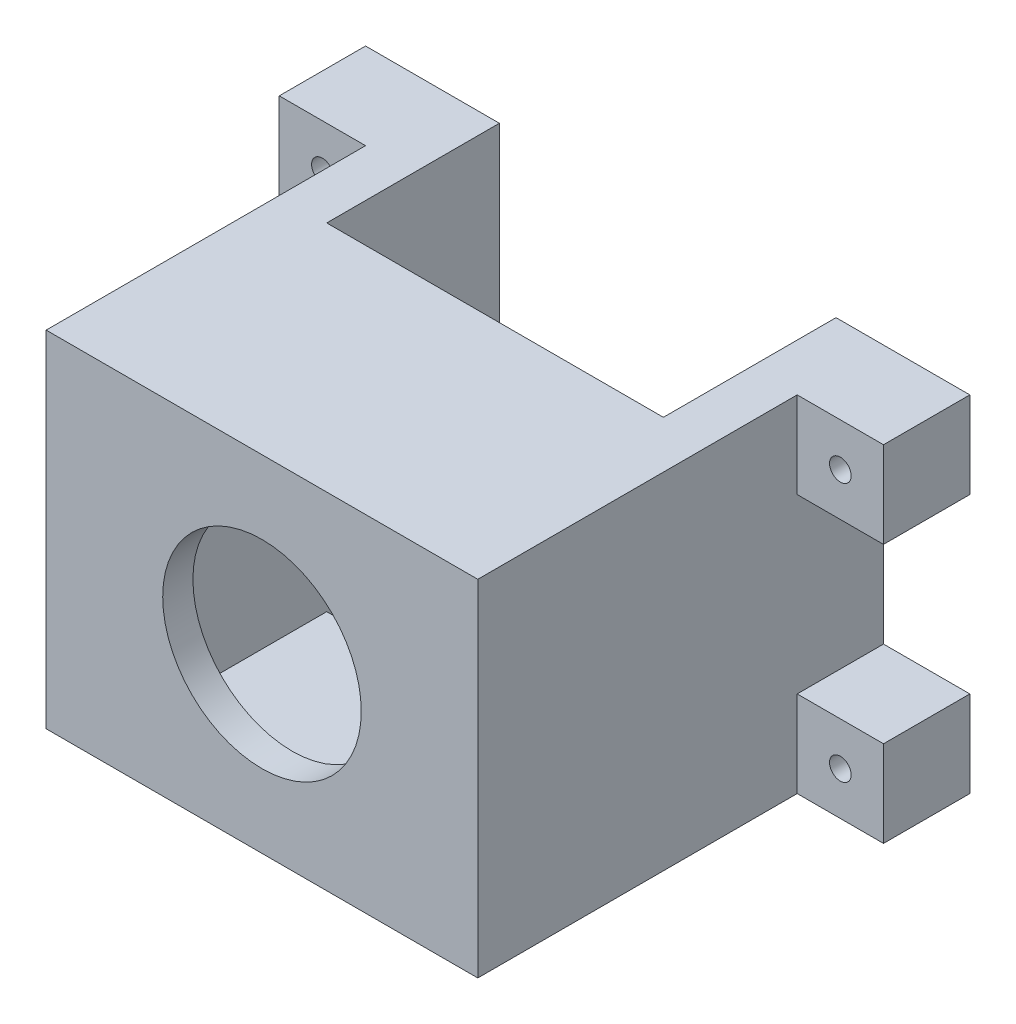
ISO-10303-21;
HEADER;
FILE_DESCRIPTION(('STEP AP214'),'2;1');
FILE_NAME('part.step','',(''),(''),'','','');
FILE_SCHEMA(('AUTOMOTIVE_DESIGN { 1 0 10303 214 1 1 1 1 }'));
ENDSEC;
DATA;
#1=APPLICATION_CONTEXT('core data for automotive mechanical design processes');
#2=APPLICATION_PROTOCOL_DEFINITION('international standard','automotive_design',2000,#1);
#3=PRODUCT_CONTEXT('',#1,'mechanical');
#4=PRODUCT('Part','Part','',(#3));
#5=PRODUCT_RELATED_PRODUCT_CATEGORY('part','',(#4));
#6=PRODUCT_DEFINITION_FORMATION('','',#4);
#7=PRODUCT_DEFINITION_CONTEXT('part definition',#1,'design');
#8=PRODUCT_DEFINITION('design','',#6,#7);
#9=PRODUCT_DEFINITION_SHAPE('','',#8);
#10=(LENGTH_UNIT() NAMED_UNIT(*) SI_UNIT(.MILLI.,.METRE.));
#11=(NAMED_UNIT(*) PLANE_ANGLE_UNIT() SI_UNIT($,.RADIAN.));
#12=(NAMED_UNIT(*) SI_UNIT($,.STERADIAN.) SOLID_ANGLE_UNIT());
#13=UNCERTAINTY_MEASURE_WITH_UNIT(LENGTH_MEASURE(1.E-05),#10,'distance_accuracy_value','');
#14=(GEOMETRIC_REPRESENTATION_CONTEXT(3) GLOBAL_UNCERTAINTY_ASSIGNED_CONTEXT((#13)) GLOBAL_UNIT_ASSIGNED_CONTEXT((#10,
#11,#12)) REPRESENTATION_CONTEXT('',''));
#15=CARTESIAN_POINT('',(0.,0.,0.));
#16=DIRECTION('',(0.,0.,1.));
#17=DIRECTION('',(1.,0.,0.));
#18=AXIS2_PLACEMENT_3D('',#15,#16,#17);
#19=CARTESIAN_POINT('',(0.,0.,0.));
#20=DIRECTION('',(0.,0.,1.));
#21=DIRECTION('',(1.,0.,0.));
#22=AXIS2_PLACEMENT_3D('',#19,#20,#21);
#23=PLANE('',#22);
#24=CARTESIAN_POINT('',(-30.,-15.,0.));
#25=DIRECTION('',(0.,0.,1.));
#26=DIRECTION('',(1.,0.,0.));
#27=AXIS2_PLACEMENT_3D('',#24,#25,#26);
#28=CIRCLE('',#27,1.25);
#29=CARTESIAN_POINT('',(-28.75,-15.,0.));
#30=VERTEX_POINT('',#29);
#31=EDGE_CURVE('E407',#30,#30,#28,.T.);
#32=ORIENTED_EDGE('',*,*,#31,.T.);
#33=EDGE_LOOP('',(#32));
#34=FACE_BOUND('',#33,.T.);
#35=CARTESIAN_POINT('',(-30.,15.,0.));
#36=DIRECTION('',(0.,0.,1.));
#37=DIRECTION('',(1.,0.,0.));
#38=AXIS2_PLACEMENT_3D('',#35,#36,#37);
#39=CIRCLE('',#38,1.25);
#40=CARTESIAN_POINT('',(-28.75,15.,0.));
#41=VERTEX_POINT('',#40);
#42=EDGE_CURVE('E360',#41,#41,#39,.T.);
#43=ORIENTED_EDGE('',*,*,#42,.T.);
#44=EDGE_LOOP('',(#43));
#45=FACE_BOUND('',#44,.T.);
#46=DIRECTION('',(-1.,0.,0.));
#47=VECTOR('',#46,1.);
#48=CARTESIAN_POINT('',(-25.,20.,0.));
#49=LINE('',#48,#47);
#50=CARTESIAN_POINT('',(-19.5,20.,0.));
#51=VERTEX_POINT('',#50);
#52=CARTESIAN_POINT('',(-35.,20.,0.));
#53=VERTEX_POINT('',#52);
#54=EDGE_CURVE('E203',#51,#53,#49,.T.);
#55=ORIENTED_EDGE('',*,*,#54,.F.);
#56=DIRECTION('',(0.,-1.,0.));
#57=VECTOR('',#56,1.);
#58=CARTESIAN_POINT('',(-19.5,19.,0.));
#59=LINE('',#58,#57);
#60=CARTESIAN_POINT('',(-19.5,-20.,0.));
#61=VERTEX_POINT('',#60);
#62=EDGE_CURVE('E214',#51,#61,#59,.T.);
#63=ORIENTED_EDGE('',*,*,#62,.T.);
#64=DIRECTION('',(1.,0.,0.));
#65=VECTOR('',#64,1.);
#66=CARTESIAN_POINT('',(-25.,-20.,0.));
#67=LINE('',#66,#65);
#68=CARTESIAN_POINT('',(-35.,-20.,0.));
#69=VERTEX_POINT('',#68);
#70=EDGE_CURVE('E236',#69,#61,#67,.T.);
#71=ORIENTED_EDGE('',*,*,#70,.F.);
#72=DIRECTION('',(0.,-1.,0.));
#73=VECTOR('',#72,1.);
#74=CARTESIAN_POINT('',(-35.,-10.,0.));
#75=LINE('',#74,#73);
#76=CARTESIAN_POINT('',(-35.,-10.,0.));
#77=VERTEX_POINT('',#76);
#78=EDGE_CURVE('E273',#77,#69,#75,.T.);
#79=ORIENTED_EDGE('',*,*,#78,.F.);
#80=DIRECTION('',(-1.,0.,0.));
#81=VECTOR('',#80,1.);
#82=CARTESIAN_POINT('',(-35.,-10.,0.));
#83=LINE('',#82,#81);
#84=CARTESIAN_POINT('',(-25.,-10.,0.));
#85=VERTEX_POINT('',#84);
#86=EDGE_CURVE('E286',#85,#77,#83,.T.);
#87=ORIENTED_EDGE('',*,*,#86,.F.);
#88=DIRECTION('',(0.,-1.,0.));
#89=VECTOR('',#88,1.);
#90=CARTESIAN_POINT('',(-25.,20.,0.));
#91=LINE('',#90,#89);
#92=CARTESIAN_POINT('',(-25.,10.,0.));
#93=VERTEX_POINT('',#92);
#94=EDGE_CURVE('E229',#93,#85,#91,.T.);
#95=ORIENTED_EDGE('',*,*,#94,.F.);
#96=DIRECTION('',(-1.,0.,0.));
#97=VECTOR('',#96,1.);
#98=CARTESIAN_POINT('',(-35.,10.,0.));
#99=LINE('',#98,#97);
#100=CARTESIAN_POINT('',(-35.,10.,0.));
#101=VERTEX_POINT('',#100);
#102=EDGE_CURVE('E362',#93,#101,#99,.T.);
#103=ORIENTED_EDGE('',*,*,#102,.T.);
#104=DIRECTION('',(0.,1.,0.));
#105=VECTOR('',#104,1.);
#106=CARTESIAN_POINT('',(-35.,10.,0.));
#107=LINE('',#106,#105);
#108=EDGE_CURVE('E225',#101,#53,#107,.T.);
#109=ORIENTED_EDGE('',*,*,#108,.T.);
#110=EDGE_LOOP('',(#55,#63,#71,#79,#87,#95,#103,#109));
#111=FACE_BOUND('',#110,.T.);
#112=ADVANCED_FACE('F41',(#34,#45,#111),#23,.F.);
#113=CARTESIAN_POINT('',(30.,-15.,0.));
#114=DIRECTION('',(0.,0.,1.));
#115=DIRECTION('',(1.,0.,0.));
#116=AXIS2_PLACEMENT_3D('',#113,#114,#115);
#117=CIRCLE('',#116,1.25);
#118=CARTESIAN_POINT('',(31.25,-15.,0.));
#119=VERTEX_POINT('',#118);
#120=EDGE_CURVE('E401',#119,#119,#117,.T.);
#121=ORIENTED_EDGE('',*,*,#120,.T.);
#122=EDGE_LOOP('',(#121));
#123=FACE_BOUND('',#122,.T.);
#124=CARTESIAN_POINT('',(30.,15.,0.));
#125=DIRECTION('',(0.,0.,1.));
#126=DIRECTION('',(1.,0.,0.));
#127=AXIS2_PLACEMENT_3D('',#124,#125,#126);
#128=CIRCLE('',#127,1.25);
#129=CARTESIAN_POINT('',(31.25,15.,0.));
#130=VERTEX_POINT('',#129);
#131=EDGE_CURVE('E806',#130,#130,#128,.T.);
#132=ORIENTED_EDGE('',*,*,#131,.T.);
#133=EDGE_LOOP('',(#132));
#134=FACE_BOUND('',#133,.T.);
#135=DIRECTION('',(0.,1.,0.));
#136=VECTOR('',#135,1.);
#137=CARTESIAN_POINT('',(19.5,19.,0.));
#138=LINE('',#137,#136);
#139=CARTESIAN_POINT('',(19.5,-20.,0.));
#140=VERTEX_POINT('',#139);
#141=CARTESIAN_POINT('',(19.5,20.,0.));
#142=VERTEX_POINT('',#141);
#143=EDGE_CURVE('E221',#140,#142,#138,.T.);
#144=ORIENTED_EDGE('',*,*,#143,.T.);
#145=CARTESIAN_POINT('',(35.,20.,0.));
#146=VERTEX_POINT('',#145);
#147=EDGE_CURVE('E226',#146,#142,#49,.T.);
#148=ORIENTED_EDGE('',*,*,#147,.F.);
#149=DIRECTION('',(0.,-1.,0.));
#150=VECTOR('',#149,1.);
#151=CARTESIAN_POINT('',(35.,10.,0.));
#152=LINE('',#151,#150);
#153=CARTESIAN_POINT('',(35.,10.,0.));
#154=VERTEX_POINT('',#153);
#155=EDGE_CURVE('E357',#146,#154,#152,.T.);
#156=ORIENTED_EDGE('',*,*,#155,.T.);
#157=CARTESIAN_POINT('',(25.,10.,0.));
#158=VERTEX_POINT('',#157);
#159=EDGE_CURVE('E347',#154,#158,#99,.T.);
#160=ORIENTED_EDGE('',*,*,#159,.T.);
#161=DIRECTION('',(0.,1.,0.));
#162=VECTOR('',#161,1.);
#163=CARTESIAN_POINT('',(25.,20.,0.));
#164=LINE('',#163,#162);
#165=CARTESIAN_POINT('',(25.,-10.,0.));
#166=VERTEX_POINT('',#165);
#167=EDGE_CURVE('E61',#166,#158,#164,.T.);
#168=ORIENTED_EDGE('',*,*,#167,.F.);
#169=CARTESIAN_POINT('',(35.,-10.,0.));
#170=VERTEX_POINT('',#169);
#171=EDGE_CURVE('E287',#170,#166,#83,.T.);
#172=ORIENTED_EDGE('',*,*,#171,.F.);
#173=DIRECTION('',(0.,1.,0.));
#174=VECTOR('',#173,1.);
#175=CARTESIAN_POINT('',(35.,-10.,0.));
#176=LINE('',#175,#174);
#177=CARTESIAN_POINT('',(35.,-20.,0.));
#178=VERTEX_POINT('',#177);
#179=EDGE_CURVE('E255',#178,#170,#176,.T.);
#180=ORIENTED_EDGE('',*,*,#179,.F.);
#181=EDGE_CURVE('E235',#140,#178,#67,.T.);
#182=ORIENTED_EDGE('',*,*,#181,.F.);
#183=EDGE_LOOP('',(#144,#148,#156,#160,#168,#172,#180,#182));
#184=FACE_BOUND('',#183,.T.);
#185=ADVANCED_FACE('F440',(#123,#134,#184),#23,.F.);
#186=CARTESIAN_POINT('',(-25.,20.,47.));
#187=DIRECTION('',(0.,-1.,0.));
#188=DIRECTION('',(0.,0.,-1.));
#189=AXIS2_PLACEMENT_3D('',#186,#187,#188);
#190=PLANE('',#189);
#191=DIRECTION('',(0.,0.,-1.));
#192=VECTOR('',#191,1.);
#193=CARTESIAN_POINT('',(-19.5,20.,47.));
#194=LINE('',#193,#192);
#195=CARTESIAN_POINT('',(-19.5,20.,20.));
#196=VERTEX_POINT('',#195);
#197=EDGE_CURVE('E199',#196,#51,#194,.T.);
#198=ORIENTED_EDGE('',*,*,#197,.T.);
#199=ORIENTED_EDGE('',*,*,#54,.T.);
#200=DIRECTION('',(0.,0.,-1.));
#201=VECTOR('',#200,1.);
#202=CARTESIAN_POINT('',(-35.,20.,10.));
#203=LINE('',#202,#201);
#204=CARTESIAN_POINT('',(-35.,20.,10.));
#205=VERTEX_POINT('',#204);
#206=EDGE_CURVE('E369',#205,#53,#203,.T.);
#207=ORIENTED_EDGE('',*,*,#206,.F.);
#208=DIRECTION('',(1.,0.,0.));
#209=VECTOR('',#208,1.);
#210=CARTESIAN_POINT('',(-35.,20.,10.));
#211=LINE('',#210,#209);
#212=CARTESIAN_POINT('',(-25.,20.,9.99999999999999));
#213=VERTEX_POINT('',#212);
#214=EDGE_CURVE('E343',#205,#213,#211,.T.);
#215=ORIENTED_EDGE('',*,*,#214,.T.);
#216=DIRECTION('',(0.,0.,-1.));
#217=VECTOR('',#216,1.);
#218=CARTESIAN_POINT('',(-25.,20.,47.));
#219=LINE('',#218,#217);
#220=CARTESIAN_POINT('',(-25.,20.,47.));
#221=VERTEX_POINT('',#220);
#222=EDGE_CURVE('E245',#221,#213,#219,.T.);
#223=ORIENTED_EDGE('',*,*,#222,.F.);
#224=DIRECTION('',(-1.,0.,0.));
#225=VECTOR('',#224,1.);
#226=CARTESIAN_POINT('',(-25.,20.,47.));
#227=LINE('',#226,#225);
#228=CARTESIAN_POINT('',(25.,20.,47.));
#229=VERTEX_POINT('',#228);
#230=EDGE_CURVE('E314',#229,#221,#227,.T.);
#231=ORIENTED_EDGE('',*,*,#230,.F.);
#232=DIRECTION('',(0.,0.,-1.));
#233=VECTOR('',#232,1.);
#234=CARTESIAN_POINT('',(25.,20.,47.));
#235=LINE('',#234,#233);
#236=CARTESIAN_POINT('',(25.,20.,9.99999999999999));
#237=VERTEX_POINT('',#236);
#238=EDGE_CURVE('E49',#229,#237,#235,.T.);
#239=ORIENTED_EDGE('',*,*,#238,.T.);
#240=CARTESIAN_POINT('',(35.,20.,10.));
#241=VERTEX_POINT('',#240);
#242=EDGE_CURVE('E333',#237,#241,#211,.T.);
#243=ORIENTED_EDGE('',*,*,#242,.T.);
#244=DIRECTION('',(0.,0.,-1.));
#245=VECTOR('',#244,1.);
#246=CARTESIAN_POINT('',(35.,20.,10.));
#247=LINE('',#246,#245);
#248=EDGE_CURVE('E371',#241,#146,#247,.T.);
#249=ORIENTED_EDGE('',*,*,#248,.T.);
#250=ORIENTED_EDGE('',*,*,#147,.T.);
#251=DIRECTION('',(0.,0.,1.));
#252=VECTOR('',#251,1.);
#253=CARTESIAN_POINT('',(19.5,20.,47.));
#254=LINE('',#253,#252);
#255=CARTESIAN_POINT('',(19.5,20.,20.));
#256=VERTEX_POINT('',#255);
#257=EDGE_CURVE('E396',#142,#256,#254,.T.);
#258=ORIENTED_EDGE('',*,*,#257,.T.);
#259=DIRECTION('',(1.,0.,0.));
#260=VECTOR('',#259,1.);
#261=CARTESIAN_POINT('',(-25.,20.,20.));
#262=LINE('',#261,#260);
#263=EDGE_CURVE('E206',#196,#256,#262,.T.);
#264=ORIENTED_EDGE('',*,*,#263,.F.);
#265=EDGE_LOOP('',(#198,#199,#207,#215,#223,#231,#239,#243,#249,#250,#258,#264));
#266=FACE_BOUND('',#265,.T.);
#267=ADVANCED_FACE('F201',(#266),#190,.F.);
#268=CARTESIAN_POINT('',(-19.5,19.,43.5));
#269=DIRECTION('',(0.,-1.,0.));
#270=DIRECTION('',(0.,0.,-1.));
#271=AXIS2_PLACEMENT_3D('',#268,#269,#270);
#272=PLANE('',#271);
#273=DIRECTION('',(0.,0.,-1.));
#274=VECTOR('',#273,1.);
#275=CARTESIAN_POINT('',(-19.5,19.,43.5));
#276=LINE('',#275,#274);
#277=CARTESIAN_POINT('',(-19.5,19.,43.5));
#278=VERTEX_POINT('',#277);
#279=CARTESIAN_POINT('',(-19.5,19.,20.));
#280=VERTEX_POINT('',#279);
#281=EDGE_CURVE('E258',#278,#280,#276,.T.);
#282=ORIENTED_EDGE('',*,*,#281,.T.);
#283=DIRECTION('',(1.,0.,0.));
#284=VECTOR('',#283,1.);
#285=CARTESIAN_POINT('',(-19.5,19.,20.));
#286=LINE('',#285,#284);
#287=CARTESIAN_POINT('',(19.5,19.,20.));
#288=VERTEX_POINT('',#287);
#289=EDGE_CURVE('E387',#280,#288,#286,.T.);
#290=ORIENTED_EDGE('',*,*,#289,.T.);
#291=DIRECTION('',(0.,0.,-1.));
#292=VECTOR('',#291,1.);
#293=CARTESIAN_POINT('',(19.5,19.,43.5));
#294=LINE('',#293,#292);
#295=CARTESIAN_POINT('',(19.5,19.,43.5));
#296=VERTEX_POINT('',#295);
#297=EDGE_CURVE('E251',#296,#288,#294,.T.);
#298=ORIENTED_EDGE('',*,*,#297,.F.);
#299=DIRECTION('',(-1.,0.,0.));
#300=VECTOR('',#299,1.);
#301=CARTESIAN_POINT('',(-19.5,19.,43.5));
#302=LINE('',#301,#300);
#303=EDGE_CURVE('E411',#296,#278,#302,.T.);
#304=ORIENTED_EDGE('',*,*,#303,.T.);
#305=EDGE_LOOP('',(#282,#290,#298,#304));
#306=FACE_BOUND('',#305,.T.);
#307=ADVANCED_FACE('F435',(#306),#272,.T.);
#308=CARTESIAN_POINT('',(-19.5,-19.,43.5));
#309=DIRECTION('',(0.,1.,0.));
#310=DIRECTION('',(0.,0.,1.));
#311=AXIS2_PLACEMENT_3D('',#308,#309,#310);
#312=PLANE('',#311);
#313=DIRECTION('',(0.,0.,-1.));
#314=VECTOR('',#313,1.);
#315=CARTESIAN_POINT('',(19.5,-19.,43.5));
#316=LINE('',#315,#314);
#317=CARTESIAN_POINT('',(19.5,-19.,43.5));
#318=VERTEX_POINT('',#317);
#319=CARTESIAN_POINT('',(19.5,-19.,20.));
#320=VERTEX_POINT('',#319);
#321=EDGE_CURVE('E417',#318,#320,#316,.T.);
#322=ORIENTED_EDGE('',*,*,#321,.T.);
#323=DIRECTION('',(-1.,0.,0.));
#324=VECTOR('',#323,1.);
#325=CARTESIAN_POINT('',(-19.5,-19.,20.));
#326=LINE('',#325,#324);
#327=CARTESIAN_POINT('',(-19.5,-19.,20.));
#328=VERTEX_POINT('',#327);
#329=EDGE_CURVE('E11',#320,#328,#326,.T.);
#330=ORIENTED_EDGE('',*,*,#329,.T.);
#331=DIRECTION('',(0.,0.,-1.));
#332=VECTOR('',#331,1.);
#333=CARTESIAN_POINT('',(-19.5,-19.,43.5));
#334=LINE('',#333,#332);
#335=CARTESIAN_POINT('',(-19.5,-19.,43.5));
#336=VERTEX_POINT('',#335);
#337=EDGE_CURVE('E265',#336,#328,#334,.T.);
#338=ORIENTED_EDGE('',*,*,#337,.F.);
#339=DIRECTION('',(1.,0.,0.));
#340=VECTOR('',#339,1.);
#341=CARTESIAN_POINT('',(-19.5,-19.,43.5));
#342=LINE('',#341,#340);
#343=EDGE_CURVE('E415',#336,#318,#342,.T.);
#344=ORIENTED_EDGE('',*,*,#343,.T.);
#345=EDGE_LOOP('',(#322,#330,#338,#344));
#346=FACE_BOUND('',#345,.T.);
#347=ADVANCED_FACE('F427',(#346),#312,.T.);
#348=CARTESIAN_POINT('',(25.,20.,47.));
#349=DIRECTION('',(-1.,0.,0.));
#350=DIRECTION('',(0.,0.,1.));
#351=AXIS2_PLACEMENT_3D('',#348,#349,#350);
#352=PLANE('',#351);
#353=ORIENTED_EDGE('',*,*,#167,.T.);
#354=DIRECTION('',(0.,0.,1.));
#355=VECTOR('',#354,1.);
#356=CARTESIAN_POINT('',(25.,10.,47.));
#357=LINE('',#356,#355);
#358=CARTESIAN_POINT('',(25.,10.,9.99999999999999));
#359=VERTEX_POINT('',#358);
#360=EDGE_CURVE('E56',#158,#359,#357,.T.);
#361=ORIENTED_EDGE('',*,*,#360,.T.);
#362=DIRECTION('',(0.,1.,0.));
#363=VECTOR('',#362,1.);
#364=CARTESIAN_POINT('',(25.,20.,9.99999999999999));
#365=LINE('',#364,#363);
#366=EDGE_CURVE('E330',#359,#237,#365,.T.);
#367=ORIENTED_EDGE('',*,*,#366,.T.);
#368=ORIENTED_EDGE('',*,*,#238,.F.);
#369=DIRECTION('',(0.,1.,0.));
#370=VECTOR('',#369,1.);
#371=CARTESIAN_POINT('',(25.,20.,47.));
#372=LINE('',#371,#370);
#373=CARTESIAN_POINT('',(25.,-20.,47.));
#374=VERTEX_POINT('',#373);
#375=EDGE_CURVE('E238',#374,#229,#372,.T.);
#376=ORIENTED_EDGE('',*,*,#375,.F.);
#377=DIRECTION('',(0.,0.,-1.));
#378=VECTOR('',#377,1.);
#379=CARTESIAN_POINT('',(25.,-20.,47.));
#380=LINE('',#379,#378);
#381=CARTESIAN_POINT('',(25.,-20.,9.99999999999999));
#382=VERTEX_POINT('',#381);
#383=EDGE_CURVE('E239',#374,#382,#380,.T.);
#384=ORIENTED_EDGE('',*,*,#383,.T.);
#385=DIRECTION('',(0.,1.,0.));
#386=VECTOR('',#385,1.);
#387=CARTESIAN_POINT('',(25.,20.,9.99999999999999));
#388=LINE('',#387,#386);
#389=CARTESIAN_POINT('',(25.,-10.,9.99999999999999));
#390=VERTEX_POINT('',#389);
#391=EDGE_CURVE('E230',#382,#390,#388,.T.);
#392=ORIENTED_EDGE('',*,*,#391,.T.);
#393=DIRECTION('',(0.,0.,1.));
#394=VECTOR('',#393,1.);
#395=CARTESIAN_POINT('',(25.,-10.,47.));
#396=LINE('',#395,#394);
#397=EDGE_CURVE('E306',#166,#390,#396,.T.);
#398=ORIENTED_EDGE('',*,*,#397,.F.);
#399=EDGE_LOOP('',(#353,#361,#367,#368,#376,#384,#392,#398));
#400=FACE_BOUND('',#399,.T.);
#401=ADVANCED_FACE('F43',(#400),#352,.F.);
#402=CARTESIAN_POINT('',(-25.,20.,47.));
#403=DIRECTION('',(1.,0.,0.));
#404=DIRECTION('',(0.,1.,0.));
#405=AXIS2_PLACEMENT_3D('',#402,#403,#404);
#406=PLANE('',#405);
#407=DIRECTION('',(0.,-1.,0.));
#408=VECTOR('',#407,1.);
#409=CARTESIAN_POINT('',(-25.,20.,9.99999999999999));
#410=LINE('',#409,#408);
#411=CARTESIAN_POINT('',(-25.,10.,9.99999999999999));
#412=VERTEX_POINT('',#411);
#413=EDGE_CURVE('E373',#213,#412,#410,.T.);
#414=ORIENTED_EDGE('',*,*,#413,.T.);
#415=DIRECTION('',(0.,0.,-1.));
#416=VECTOR('',#415,1.);
#417=CARTESIAN_POINT('',(-25.,10.,47.));
#418=LINE('',#417,#416);
#419=EDGE_CURVE('E376',#412,#93,#418,.T.);
#420=ORIENTED_EDGE('',*,*,#419,.T.);
#421=ORIENTED_EDGE('',*,*,#94,.T.);
#422=DIRECTION('',(0.,0.,-1.));
#423=VECTOR('',#422,1.);
#424=CARTESIAN_POINT('',(-25.,-10.,47.));
#425=LINE('',#424,#423);
#426=CARTESIAN_POINT('',(-25.,-10.,9.99999999999999));
#427=VERTEX_POINT('',#426);
#428=EDGE_CURVE('E303',#427,#85,#425,.T.);
#429=ORIENTED_EDGE('',*,*,#428,.F.);
#430=DIRECTION('',(0.,-1.,0.));
#431=VECTOR('',#430,1.);
#432=CARTESIAN_POINT('',(-25.,20.,9.99999999999999));
#433=LINE('',#432,#431);
#434=CARTESIAN_POINT('',(-25.,-20.,9.99999999999999));
#435=VERTEX_POINT('',#434);
#436=EDGE_CURVE('E309',#427,#435,#433,.T.);
#437=ORIENTED_EDGE('',*,*,#436,.T.);
#438=DIRECTION('',(0.,0.,-1.));
#439=VECTOR('',#438,1.);
#440=CARTESIAN_POINT('',(-25.,-20.,47.));
#441=LINE('',#440,#439);
#442=CARTESIAN_POINT('',(-25.,-20.,47.));
#443=VERTEX_POINT('',#442);
#444=EDGE_CURVE('E241',#443,#435,#441,.T.);
#445=ORIENTED_EDGE('',*,*,#444,.F.);
#446=DIRECTION('',(0.,-1.,0.));
#447=VECTOR('',#446,1.);
#448=CARTESIAN_POINT('',(-25.,20.,47.));
#449=LINE('',#448,#447);
#450=EDGE_CURVE('E316',#221,#443,#449,.T.);
#451=ORIENTED_EDGE('',*,*,#450,.F.);
#452=ORIENTED_EDGE('',*,*,#222,.T.);
#453=EDGE_LOOP('',(#414,#420,#421,#429,#437,#445,#451,#452));
#454=FACE_BOUND('',#453,.T.);
#455=ADVANCED_FACE('F473',(#454),#406,.F.);
#456=CARTESIAN_POINT('',(-25.,-20.,47.));
#457=DIRECTION('',(0.,1.,0.));
#458=DIRECTION('',(0.,0.,1.));
#459=AXIS2_PLACEMENT_3D('',#456,#457,#458);
#460=PLANE('',#459);
#461=ORIENTED_EDGE('',*,*,#70,.T.);
#462=DIRECTION('',(0.,0.,1.));
#463=VECTOR('',#462,1.);
#464=CARTESIAN_POINT('',(-19.5,-20.,47.));
#465=LINE('',#464,#463);
#466=CARTESIAN_POINT('',(-19.5,-20.,20.));
#467=VERTEX_POINT('',#466);
#468=EDGE_CURVE('E211',#61,#467,#465,.T.);
#469=ORIENTED_EDGE('',*,*,#468,.T.);
#470=DIRECTION('',(-1.,0.,0.));
#471=VECTOR('',#470,1.);
#472=CARTESIAN_POINT('',(-25.,-20.,20.));
#473=LINE('',#472,#471);
#474=CARTESIAN_POINT('',(19.5,-20.,20.));
#475=VERTEX_POINT('',#474);
#476=EDGE_CURVE('E390',#475,#467,#473,.T.);
#477=ORIENTED_EDGE('',*,*,#476,.F.);
#478=DIRECTION('',(0.,0.,-1.));
#479=VECTOR('',#478,1.);
#480=CARTESIAN_POINT('',(19.5,-20.,47.));
#481=LINE('',#480,#479);
#482=EDGE_CURVE('E393',#475,#140,#481,.T.);
#483=ORIENTED_EDGE('',*,*,#482,.T.);
#484=ORIENTED_EDGE('',*,*,#181,.T.);
#485=DIRECTION('',(0.,0.,-1.));
#486=VECTOR('',#485,1.);
#487=CARTESIAN_POINT('',(35.,-20.,10.));
#488=LINE('',#487,#486);
#489=CARTESIAN_POINT('',(35.,-20.,10.));
#490=VERTEX_POINT('',#489);
#491=EDGE_CURVE('E283',#490,#178,#488,.T.);
#492=ORIENTED_EDGE('',*,*,#491,.F.);
#493=DIRECTION('',(1.,0.,0.));
#494=VECTOR('',#493,1.);
#495=CARTESIAN_POINT('',(-35.,-20.,10.));
#496=LINE('',#495,#494);
#497=EDGE_CURVE('E279',#382,#490,#496,.T.);
#498=ORIENTED_EDGE('',*,*,#497,.F.);
#499=ORIENTED_EDGE('',*,*,#383,.F.);
#500=DIRECTION('',(1.,0.,0.));
#501=VECTOR('',#500,1.);
#502=CARTESIAN_POINT('',(-25.,-20.,47.));
#503=LINE('',#502,#501);
#504=EDGE_CURVE('E242',#443,#374,#503,.T.);
#505=ORIENTED_EDGE('',*,*,#504,.F.);
#506=ORIENTED_EDGE('',*,*,#444,.T.);
#507=CARTESIAN_POINT('',(-35.,-20.,10.));
#508=VERTEX_POINT('',#507);
#509=EDGE_CURVE('E280',#508,#435,#496,.T.);
#510=ORIENTED_EDGE('',*,*,#509,.F.);
#511=DIRECTION('',(0.,0.,-1.));
#512=VECTOR('',#511,1.);
#513=CARTESIAN_POINT('',(-35.,-20.,10.));
#514=LINE('',#513,#512);
#515=EDGE_CURVE('E294',#508,#69,#514,.T.);
#516=ORIENTED_EDGE('',*,*,#515,.T.);
#517=EDGE_LOOP('',(#461,#469,#477,#483,#484,#492,#498,#499,#505,#506,#510,#516));
#518=FACE_BOUND('',#517,.T.);
#519=ADVANCED_FACE('F327',(#518),#460,.F.);
#520=CARTESIAN_POINT('',(0.,0.,47.));
#521=DIRECTION('',(0.,0.,1.));
#522=DIRECTION('',(1.,0.,0.));
#523=AXIS2_PLACEMENT_3D('',#520,#521,#522);
#524=PLANE('',#523);
#525=CARTESIAN_POINT('',(0.,0.,47.));
#526=DIRECTION('',(0.,0.,1.));
#527=DIRECTION('',(1.,0.,0.));
#528=AXIS2_PLACEMENT_3D('',#525,#526,#527);
#529=CIRCLE('',#528,11.5);
#530=CARTESIAN_POINT('',(11.5,0.,47.));
#531=VERTEX_POINT('',#530);
#532=EDGE_CURVE('E250',#531,#531,#529,.T.);
#533=ORIENTED_EDGE('',*,*,#532,.F.);
#534=EDGE_LOOP('',(#533));
#535=FACE_BOUND('',#534,.T.);
#536=ORIENTED_EDGE('',*,*,#375,.T.);
#537=ORIENTED_EDGE('',*,*,#230,.T.);
#538=ORIENTED_EDGE('',*,*,#450,.T.);
#539=ORIENTED_EDGE('',*,*,#504,.T.);
#540=EDGE_LOOP('',(#536,#537,#538,#539));
#541=FACE_BOUND('',#540,.T.);
#542=ADVANCED_FACE('F320',(#535,#541),#524,.T.);
#543=CARTESIAN_POINT('',(-35.,-10.,10.));
#544=DIRECTION('',(1.,0.,0.));
#545=DIRECTION('',(0.,0.,-1.));
#546=AXIS2_PLACEMENT_3D('',#543,#544,#545);
#547=PLANE('',#546);
#548=ORIENTED_EDGE('',*,*,#78,.T.);
#549=ORIENTED_EDGE('',*,*,#515,.F.);
#550=DIRECTION('',(0.,-1.,0.));
#551=VECTOR('',#550,1.);
#552=CARTESIAN_POINT('',(-35.,-10.,10.));
#553=LINE('',#552,#551);
#554=CARTESIAN_POINT('',(-35.,-10.,10.));
#555=VERTEX_POINT('',#554);
#556=EDGE_CURVE('E277',#555,#508,#553,.T.);
#557=ORIENTED_EDGE('',*,*,#556,.F.);
#558=DIRECTION('',(0.,0.,-1.));
#559=VECTOR('',#558,1.);
#560=CARTESIAN_POINT('',(-35.,-10.,10.));
#561=LINE('',#560,#559);
#562=EDGE_CURVE('E297',#555,#77,#561,.T.);
#563=ORIENTED_EDGE('',*,*,#562,.T.);
#564=EDGE_LOOP('',(#548,#549,#557,#563));
#565=FACE_BOUND('',#564,.T.);
#566=ADVANCED_FACE('F501',(#565),#547,.F.);
#567=CARTESIAN_POINT('',(0.,0.,10.));
#568=DIRECTION('',(0.,0.,1.));
#569=DIRECTION('',(1.,0.,0.));
#570=AXIS2_PLACEMENT_3D('',#567,#568,#569);
#571=PLANE('',#570);
#572=CARTESIAN_POINT('',(-30.,-15.,10.));
#573=DIRECTION('',(0.,0.,1.));
#574=DIRECTION('',(1.,0.,0.));
#575=AXIS2_PLACEMENT_3D('',#572,#573,#574);
#576=CIRCLE('',#575,1.24999999999999);
#577=CARTESIAN_POINT('',(-28.75,-15.,10.));
#578=VERTEX_POINT('',#577);
#579=EDGE_CURVE('E404',#578,#578,#576,.T.);
#580=ORIENTED_EDGE('',*,*,#579,.F.);
#581=EDGE_LOOP('',(#580));
#582=FACE_BOUND('',#581,.T.);
#583=ORIENTED_EDGE('',*,*,#436,.F.);
#584=DIRECTION('',(-1.,0.,0.));
#585=VECTOR('',#584,1.);
#586=CARTESIAN_POINT('',(-35.,-10.,10.));
#587=LINE('',#586,#585);
#588=EDGE_CURVE('E272',#427,#555,#587,.T.);
#589=ORIENTED_EDGE('',*,*,#588,.T.);
#590=ORIENTED_EDGE('',*,*,#556,.T.);
#591=ORIENTED_EDGE('',*,*,#509,.T.);
#592=EDGE_LOOP('',(#583,#589,#590,#591));
#593=FACE_BOUND('',#592,.T.);
#594=ADVANCED_FACE('F500',(#582,#593),#571,.T.);
#595=CARTESIAN_POINT('',(-35.,-10.,10.));
#596=DIRECTION('',(0.,-1.,0.));
#597=DIRECTION('',(0.,0.,-1.));
#598=AXIS2_PLACEMENT_3D('',#595,#596,#597);
#599=PLANE('',#598);
#600=ORIENTED_EDGE('',*,*,#588,.F.);
#601=ORIENTED_EDGE('',*,*,#428,.T.);
#602=ORIENTED_EDGE('',*,*,#86,.T.);
#603=ORIENTED_EDGE('',*,*,#562,.F.);
#604=EDGE_LOOP('',(#600,#601,#602,#603));
#605=FACE_BOUND('',#604,.T.);
#606=ADVANCED_FACE('F498',(#605),#599,.F.);
#607=CARTESIAN_POINT('',(30.,-15.,10.));
#608=DIRECTION('',(0.,0.,1.));
#609=DIRECTION('',(1.,0.,0.));
#610=AXIS2_PLACEMENT_3D('',#607,#608,#609);
#611=CIRCLE('',#610,1.24999999999999);
#612=CARTESIAN_POINT('',(31.25,-15.,10.));
#613=VERTEX_POINT('',#612);
#614=EDGE_CURVE('E210',#613,#613,#611,.T.);
#615=ORIENTED_EDGE('',*,*,#614,.F.);
#616=EDGE_LOOP('',(#615));
#617=FACE_BOUND('',#616,.T.);
#618=ORIENTED_EDGE('',*,*,#391,.F.);
#619=ORIENTED_EDGE('',*,*,#497,.T.);
#620=DIRECTION('',(0.,1.,0.));
#621=VECTOR('',#620,1.);
#622=CARTESIAN_POINT('',(35.,-10.,10.));
#623=LINE('',#622,#621);
#624=CARTESIAN_POINT('',(35.,-10.,10.));
#625=VERTEX_POINT('',#624);
#626=EDGE_CURVE('E269',#490,#625,#623,.T.);
#627=ORIENTED_EDGE('',*,*,#626,.T.);
#628=EDGE_CURVE('E274',#625,#390,#587,.T.);
#629=ORIENTED_EDGE('',*,*,#628,.T.);
#630=EDGE_LOOP('',(#618,#619,#627,#629));
#631=FACE_BOUND('',#630,.T.);
#632=ADVANCED_FACE('F494',(#617,#631),#571,.T.);
#633=ORIENTED_EDGE('',*,*,#171,.T.);
#634=ORIENTED_EDGE('',*,*,#397,.T.);
#635=ORIENTED_EDGE('',*,*,#628,.F.);
#636=DIRECTION('',(0.,0.,-1.));
#637=VECTOR('',#636,1.);
#638=CARTESIAN_POINT('',(35.,-10.,10.));
#639=LINE('',#638,#637);
#640=EDGE_CURVE('E300',#625,#170,#639,.T.);
#641=ORIENTED_EDGE('',*,*,#640,.T.);
#642=EDGE_LOOP('',(#633,#634,#635,#641));
#643=FACE_BOUND('',#642,.T.);
#644=ADVANCED_FACE('F497',(#643),#599,.F.);
#645=CARTESIAN_POINT('',(35.,-10.,10.));
#646=DIRECTION('',(-1.,0.,0.));
#647=DIRECTION('',(0.,-1.,0.));
#648=AXIS2_PLACEMENT_3D('',#645,#646,#647);
#649=PLANE('',#648);
#650=ORIENTED_EDGE('',*,*,#179,.T.);
#651=ORIENTED_EDGE('',*,*,#640,.F.);
#652=ORIENTED_EDGE('',*,*,#626,.F.);
#653=ORIENTED_EDGE('',*,*,#491,.T.);
#654=EDGE_LOOP('',(#650,#651,#652,#653));
#655=FACE_BOUND('',#654,.T.);
#656=ADVANCED_FACE('F492',(#655),#649,.F.);
#657=CARTESIAN_POINT('',(0.,0.,47.));
#658=DIRECTION('',(0.,0.,-1.));
#659=DIRECTION('',(-1.,0.,0.));
#660=AXIS2_PLACEMENT_3D('',#657,#658,#659);
#661=CYLINDRICAL_SURFACE('',#660,11.5);
#662=CARTESIAN_POINT('',(0.,0.,43.5));
#663=DIRECTION('',(0.,0.,1.));
#664=DIRECTION('',(1.,0.,0.));
#665=AXIS2_PLACEMENT_3D('',#662,#663,#664);
#666=CIRCLE('',#665,11.5);
#667=CARTESIAN_POINT('',(11.5,0.,43.5));
#668=VERTEX_POINT('',#667);
#669=EDGE_CURVE('E248',#668,#668,#666,.T.);
#670=ORIENTED_EDGE('',*,*,#669,.F.);
#671=EDGE_LOOP('',(#670));
#672=FACE_BOUND('',#671,.T.);
#673=ORIENTED_EDGE('',*,*,#532,.T.);
#674=EDGE_LOOP('',(#673));
#675=FACE_BOUND('',#674,.T.);
#676=ADVANCED_FACE('F489',(#672,#675),#661,.F.);
#677=CARTESIAN_POINT('',(19.5,19.,43.5));
#678=DIRECTION('',(-1.,0.,0.));
#679=DIRECTION('',(0.,-1.,0.));
#680=AXIS2_PLACEMENT_3D('',#677,#678,#679);
#681=PLANE('',#680);
#682=ORIENTED_EDGE('',*,*,#257,.F.);
#683=ORIENTED_EDGE('',*,*,#143,.F.);
#684=ORIENTED_EDGE('',*,*,#482,.F.);
#685=DIRECTION('',(0.,-1.,0.));
#686=VECTOR('',#685,1.);
#687=CARTESIAN_POINT('',(19.5,35.,20.));
#688=LINE('',#687,#686);
#689=EDGE_CURVE('E383',#320,#475,#688,.T.);
#690=ORIENTED_EDGE('',*,*,#689,.F.);
#691=ORIENTED_EDGE('',*,*,#321,.F.);
#692=DIRECTION('',(0.,1.,0.));
#693=VECTOR('',#692,1.);
#694=CARTESIAN_POINT('',(19.5,19.,43.5));
#695=LINE('',#694,#693);
#696=EDGE_CURVE('E220',#318,#296,#695,.T.);
#697=ORIENTED_EDGE('',*,*,#696,.T.);
#698=ORIENTED_EDGE('',*,*,#297,.T.);
#699=EDGE_CURVE('E386',#256,#288,#688,.T.);
#700=ORIENTED_EDGE('',*,*,#699,.F.);
#701=EDGE_LOOP('',(#682,#683,#684,#690,#691,#697,#698,#700));
#702=FACE_BOUND('',#701,.T.);
#703=ADVANCED_FACE('F432',(#702),#681,.T.);
#704=CARTESIAN_POINT('',(-19.5,19.,43.5));
#705=DIRECTION('',(1.,0.,0.));
#706=DIRECTION('',(0.,1.,0.));
#707=AXIS2_PLACEMENT_3D('',#704,#705,#706);
#708=PLANE('',#707);
#709=DIRECTION('',(0.,1.,0.));
#710=VECTOR('',#709,1.);
#711=CARTESIAN_POINT('',(-19.5,35.,20.));
#712=LINE('',#711,#710);
#713=EDGE_CURVE('E380',#280,#196,#712,.T.);
#714=ORIENTED_EDGE('',*,*,#713,.F.);
#715=ORIENTED_EDGE('',*,*,#281,.F.);
#716=DIRECTION('',(0.,-1.,0.));
#717=VECTOR('',#716,1.);
#718=CARTESIAN_POINT('',(-19.5,19.,43.5));
#719=LINE('',#718,#717);
#720=EDGE_CURVE('E413',#278,#336,#719,.T.);
#721=ORIENTED_EDGE('',*,*,#720,.T.);
#722=ORIENTED_EDGE('',*,*,#337,.T.);
#723=EDGE_CURVE('E382',#467,#328,#712,.T.);
#724=ORIENTED_EDGE('',*,*,#723,.F.);
#725=ORIENTED_EDGE('',*,*,#468,.F.);
#726=ORIENTED_EDGE('',*,*,#62,.F.);
#727=ORIENTED_EDGE('',*,*,#197,.F.);
#728=EDGE_LOOP('',(#714,#715,#721,#722,#724,#725,#726,#727));
#729=FACE_BOUND('',#728,.T.);
#730=ADVANCED_FACE('F215',(#729),#708,.T.);
#731=CARTESIAN_POINT('',(0.,0.,43.5));
#732=DIRECTION('',(0.,0.,1.));
#733=DIRECTION('',(1.,0.,0.));
#734=AXIS2_PLACEMENT_3D('',#731,#732,#733);
#735=PLANE('',#734);
#736=ORIENTED_EDGE('',*,*,#669,.T.);
#737=EDGE_LOOP('',(#736));
#738=FACE_BOUND('',#737,.T.);
#739=ORIENTED_EDGE('',*,*,#696,.F.);
#740=ORIENTED_EDGE('',*,*,#343,.F.);
#741=ORIENTED_EDGE('',*,*,#720,.F.);
#742=ORIENTED_EDGE('',*,*,#303,.F.);
#743=EDGE_LOOP('',(#739,#740,#741,#742));
#744=FACE_BOUND('',#743,.T.);
#745=ADVANCED_FACE('F431',(#738,#744),#735,.F.);
#746=CARTESIAN_POINT('',(-30.,-15.,10.));
#747=DIRECTION('',(0.,0.,1.));
#748=DIRECTION('',(1.,0.,0.));
#749=AXIS2_PLACEMENT_3D('',#746,#747,#748);
#750=CYLINDRICAL_SURFACE('',#749,1.24999999999999);
#751=ORIENTED_EDGE('',*,*,#31,.F.);
#752=EDGE_LOOP('',(#751));
#753=FACE_BOUND('',#752,.T.);
#754=ORIENTED_EDGE('',*,*,#579,.T.);
#755=EDGE_LOOP('',(#754));
#756=FACE_BOUND('',#755,.T.);
#757=ADVANCED_FACE('F525',(#753,#756),#750,.F.);
#758=CARTESIAN_POINT('',(30.,-15.,10.));
#759=DIRECTION('',(0.,0.,1.));
#760=DIRECTION('',(1.,0.,0.));
#761=AXIS2_PLACEMENT_3D('',#758,#759,#760);
#762=CYLINDRICAL_SURFACE('',#761,1.24999999999999);
#763=ORIENTED_EDGE('',*,*,#120,.F.);
#764=EDGE_LOOP('',(#763));
#765=FACE_BOUND('',#764,.T.);
#766=ORIENTED_EDGE('',*,*,#614,.T.);
#767=EDGE_LOOP('',(#766));
#768=FACE_BOUND('',#767,.T.);
#769=ADVANCED_FACE('F518',(#765,#768),#762,.F.);
#770=CARTESIAN_POINT('',(0.,0.,20.));
#771=DIRECTION('',(0.,0.,-1.));
#772=DIRECTION('',(-1.,0.,0.));
#773=AXIS2_PLACEMENT_3D('',#770,#771,#772);
#774=PLANE('',#773);
#775=ORIENTED_EDGE('',*,*,#476,.T.);
#776=ORIENTED_EDGE('',*,*,#723,.T.);
#777=ORIENTED_EDGE('',*,*,#329,.F.);
#778=ORIENTED_EDGE('',*,*,#689,.T.);
#779=EDGE_LOOP('',(#775,#776,#777,#778));
#780=FACE_BOUND('',#779,.T.);
#781=ADVANCED_FACE('F516',(#780),#774,.T.);
#782=ORIENTED_EDGE('',*,*,#263,.T.);
#783=ORIENTED_EDGE('',*,*,#699,.T.);
#784=ORIENTED_EDGE('',*,*,#289,.F.);
#785=ORIENTED_EDGE('',*,*,#713,.T.);
#786=EDGE_LOOP('',(#782,#783,#784,#785));
#787=FACE_BOUND('',#786,.T.);
#788=ADVANCED_FACE('F437',(#787),#774,.T.);
#789=CARTESIAN_POINT('',(-35.,10.,10.));
#790=DIRECTION('',(-1.,0.,0.));
#791=DIRECTION('',(0.,0.,1.));
#792=AXIS2_PLACEMENT_3D('',#789,#790,#791);
#793=PLANE('',#792);
#794=ORIENTED_EDGE('',*,*,#108,.F.);
#795=DIRECTION('',(0.,0.,-1.));
#796=VECTOR('',#795,1.);
#797=CARTESIAN_POINT('',(-35.,10.,10.));
#798=LINE('',#797,#796);
#799=CARTESIAN_POINT('',(-35.,10.,10.));
#800=VERTEX_POINT('',#799);
#801=EDGE_CURVE('E366',#800,#101,#798,.T.);
#802=ORIENTED_EDGE('',*,*,#801,.F.);
#803=DIRECTION('',(0.,1.,0.));
#804=VECTOR('',#803,1.);
#805=CARTESIAN_POINT('',(-35.,10.,10.));
#806=LINE('',#805,#804);
#807=EDGE_CURVE('E346',#800,#205,#806,.T.);
#808=ORIENTED_EDGE('',*,*,#807,.T.);
#809=ORIENTED_EDGE('',*,*,#206,.T.);
#810=EDGE_LOOP('',(#794,#802,#808,#809));
#811=FACE_BOUND('',#810,.T.);
#812=ADVANCED_FACE('F524',(#811),#793,.T.);
#813=CARTESIAN_POINT('',(0.,0.,10.));
#814=DIRECTION('',(0.,0.,1.));
#815=DIRECTION('',(1.,0.,0.));
#816=AXIS2_PLACEMENT_3D('',#813,#814,#815);
#817=PLANE('',#816);
#818=CARTESIAN_POINT('',(-30.,15.,10.));
#819=DIRECTION('',(0.,0.,1.));
#820=DIRECTION('',(1.,0.,0.));
#821=AXIS2_PLACEMENT_3D('',#818,#819,#820);
#822=CIRCLE('',#821,1.24999999999999);
#823=CARTESIAN_POINT('',(-28.75,15.,10.));
#824=VERTEX_POINT('',#823);
#825=EDGE_CURVE('E811',#824,#824,#822,.T.);
#826=ORIENTED_EDGE('',*,*,#825,.F.);
#827=EDGE_LOOP('',(#826));
#828=FACE_BOUND('',#827,.T.);
#829=ORIENTED_EDGE('',*,*,#413,.F.);
#830=ORIENTED_EDGE('',*,*,#214,.F.);
#831=ORIENTED_EDGE('',*,*,#807,.F.);
#832=DIRECTION('',(-1.,0.,0.));
#833=VECTOR('',#832,1.);
#834=CARTESIAN_POINT('',(-35.,10.,10.));
#835=LINE('',#834,#833);
#836=EDGE_CURVE('E353',#412,#800,#835,.T.);
#837=ORIENTED_EDGE('',*,*,#836,.F.);
#838=EDGE_LOOP('',(#829,#830,#831,#837));
#839=FACE_BOUND('',#838,.T.);
#840=ADVANCED_FACE('F457',(#828,#839),#817,.T.);
#841=CARTESIAN_POINT('',(-35.,10.,10.));
#842=DIRECTION('',(0.,-1.,0.));
#843=DIRECTION('',(0.,0.,-1.));
#844=AXIS2_PLACEMENT_3D('',#841,#842,#843);
#845=PLANE('',#844);
#846=ORIENTED_EDGE('',*,*,#419,.F.);
#847=ORIENTED_EDGE('',*,*,#836,.T.);
#848=ORIENTED_EDGE('',*,*,#801,.T.);
#849=ORIENTED_EDGE('',*,*,#102,.F.);
#850=EDGE_LOOP('',(#846,#847,#848,#849));
#851=FACE_BOUND('',#850,.T.);
#852=ADVANCED_FACE('F449',(#851),#845,.T.);
#853=ORIENTED_EDGE('',*,*,#360,.F.);
#854=ORIENTED_EDGE('',*,*,#159,.F.);
#855=DIRECTION('',(0.,0.,-1.));
#856=VECTOR('',#855,1.);
#857=CARTESIAN_POINT('',(35.,10.,10.));
#858=LINE('',#857,#856);
#859=CARTESIAN_POINT('',(35.,10.,10.));
#860=VERTEX_POINT('',#859);
#861=EDGE_CURVE('E356',#860,#154,#858,.T.);
#862=ORIENTED_EDGE('',*,*,#861,.F.);
#863=EDGE_CURVE('E354',#860,#359,#835,.T.);
#864=ORIENTED_EDGE('',*,*,#863,.T.);
#865=EDGE_LOOP('',(#853,#854,#862,#864));
#866=FACE_BOUND('',#865,.T.);
#867=ADVANCED_FACE('F447',(#866),#845,.T.);
#868=CARTESIAN_POINT('',(30.,15.,10.));
#869=DIRECTION('',(0.,0.,1.));
#870=DIRECTION('',(1.,0.,0.));
#871=AXIS2_PLACEMENT_3D('',#868,#869,#870);
#872=CIRCLE('',#871,1.24999999999999);
#873=CARTESIAN_POINT('',(31.25,15.,10.));
#874=VERTEX_POINT('',#873);
#875=EDGE_CURVE('E809',#874,#874,#872,.T.);
#876=ORIENTED_EDGE('',*,*,#875,.F.);
#877=EDGE_LOOP('',(#876));
#878=FACE_BOUND('',#877,.T.);
#879=ORIENTED_EDGE('',*,*,#366,.F.);
#880=ORIENTED_EDGE('',*,*,#863,.F.);
#881=DIRECTION('',(0.,-1.,0.));
#882=VECTOR('',#881,1.);
#883=CARTESIAN_POINT('',(35.,10.,10.));
#884=LINE('',#883,#882);
#885=EDGE_CURVE('E342',#241,#860,#884,.T.);
#886=ORIENTED_EDGE('',*,*,#885,.F.);
#887=ORIENTED_EDGE('',*,*,#242,.F.);
#888=EDGE_LOOP('',(#879,#880,#886,#887));
#889=FACE_BOUND('',#888,.T.);
#890=ADVANCED_FACE('F338',(#878,#889),#817,.T.);
#891=CARTESIAN_POINT('',(35.,10.,10.));
#892=DIRECTION('',(1.,0.,0.));
#893=DIRECTION('',(0.,1.,0.));
#894=AXIS2_PLACEMENT_3D('',#891,#892,#893);
#895=PLANE('',#894);
#896=ORIENTED_EDGE('',*,*,#155,.F.);
#897=ORIENTED_EDGE('',*,*,#248,.F.);
#898=ORIENTED_EDGE('',*,*,#885,.T.);
#899=ORIENTED_EDGE('',*,*,#861,.T.);
#900=EDGE_LOOP('',(#896,#897,#898,#899));
#901=FACE_BOUND('',#900,.T.);
#902=ADVANCED_FACE('F444',(#901),#895,.T.);
#903=CARTESIAN_POINT('',(-30.,15.,10.));
#904=DIRECTION('',(0.,0.,1.));
#905=DIRECTION('',(1.,0.,0.));
#906=AXIS2_PLACEMENT_3D('',#903,#904,#905);
#907=CYLINDRICAL_SURFACE('',#906,1.24999999999999);
#908=ORIENTED_EDGE('',*,*,#42,.F.);
#909=EDGE_LOOP('',(#908));
#910=FACE_BOUND('',#909,.T.);
#911=ORIENTED_EDGE('',*,*,#825,.T.);
#912=EDGE_LOOP('',(#911));
#913=FACE_BOUND('',#912,.T.);
#914=ADVANCED_FACE('F740',(#910,#913),#907,.F.);
#915=CARTESIAN_POINT('',(30.,15.,10.));
#916=DIRECTION('',(0.,0.,1.));
#917=DIRECTION('',(1.,0.,0.));
#918=AXIS2_PLACEMENT_3D('',#915,#916,#917);
#919=CYLINDRICAL_SURFACE('',#918,1.24999999999999);
#920=ORIENTED_EDGE('',*,*,#131,.F.);
#921=EDGE_LOOP('',(#920));
#922=FACE_BOUND('',#921,.T.);
#923=ORIENTED_EDGE('',*,*,#875,.T.);
#924=EDGE_LOOP('',(#923));
#925=FACE_BOUND('',#924,.T.);
#926=ADVANCED_FACE('F787',(#922,#925),#919,.F.);
#927=CLOSED_SHELL('',(#112,#185,#267,#307,#347,#401,#455,#519,#542,#566,#594,#606,#632,#644,
#656,#676,#703,#730,#745,#757,#769,#781,#788,#812,#840,#852,#867,#890,#902,#914,#926));
#928=MANIFOLD_SOLID_BREP('B2',#927);
#929=ADVANCED_BREP_SHAPE_REPRESENTATION('',(#18,#928),#14);
#930=SHAPE_DEFINITION_REPRESENTATION(#9,#929);
ENDSEC;
END-ISO-10303-21;
